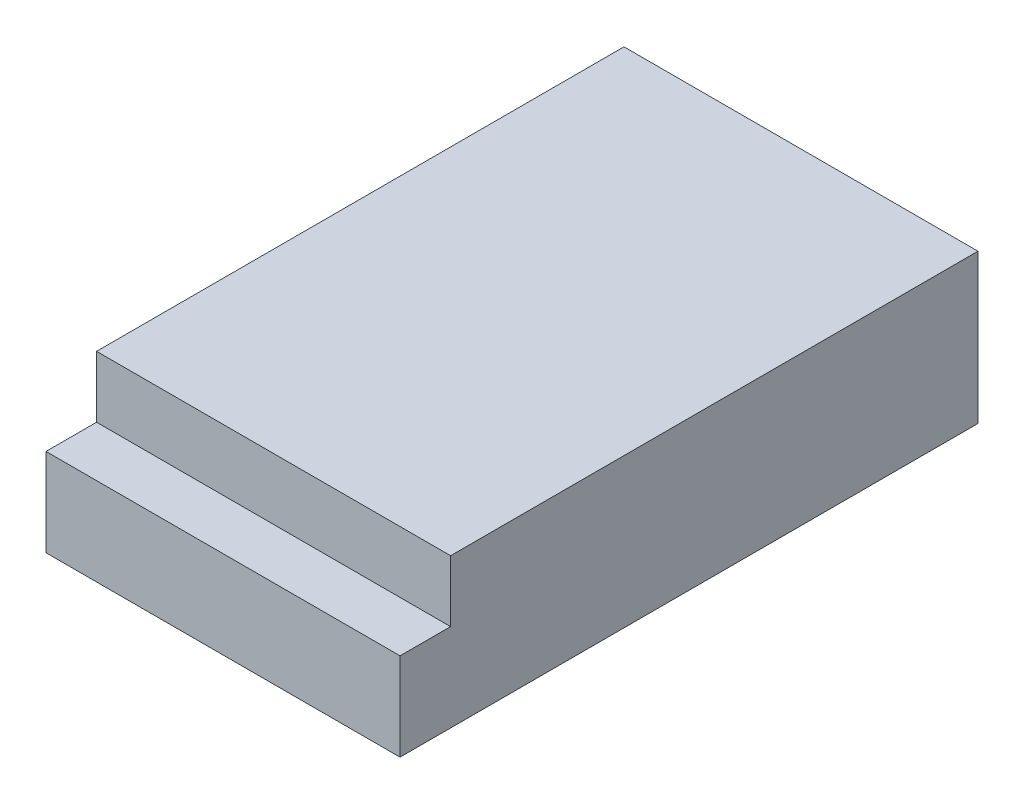
ISO-10303-21;
HEADER;
FILE_DESCRIPTION(('STEP AP214'),'2;1');
FILE_NAME('part.step','',(''),(''),'','','');
FILE_SCHEMA(('AUTOMOTIVE_DESIGN { 1 0 10303 214 1 1 1 1 }'));
ENDSEC;
DATA;
#1=APPLICATION_CONTEXT('core data for automotive mechanical design processes');
#2=APPLICATION_PROTOCOL_DEFINITION('international standard','automotive_design',2000,#1);
#3=PRODUCT_CONTEXT('',#1,'mechanical');
#4=PRODUCT('Part','Part','',(#3));
#5=PRODUCT_RELATED_PRODUCT_CATEGORY('part','',(#4));
#6=PRODUCT_DEFINITION_FORMATION('','',#4);
#7=PRODUCT_DEFINITION_CONTEXT('part definition',#1,'design');
#8=PRODUCT_DEFINITION('design','',#6,#7);
#9=PRODUCT_DEFINITION_SHAPE('','',#8);
#10=(LENGTH_UNIT() NAMED_UNIT(*) SI_UNIT(.MILLI.,.METRE.));
#11=(NAMED_UNIT(*) PLANE_ANGLE_UNIT() SI_UNIT($,.RADIAN.));
#12=(NAMED_UNIT(*) SI_UNIT($,.STERADIAN.) SOLID_ANGLE_UNIT());
#13=UNCERTAINTY_MEASURE_WITH_UNIT(LENGTH_MEASURE(1.E-05),#10,'distance_accuracy_value','');
#14=(GEOMETRIC_REPRESENTATION_CONTEXT(3) GLOBAL_UNCERTAINTY_ASSIGNED_CONTEXT((#13)) GLOBAL_UNIT_ASSIGNED_CONTEXT((#10,
#11,#12)) REPRESENTATION_CONTEXT('',''));
#15=CARTESIAN_POINT('',(0.,0.,0.));
#16=DIRECTION('',(0.,0.,1.));
#17=DIRECTION('',(1.,0.,0.));
#18=AXIS2_PLACEMENT_3D('',#15,#16,#17);
#19=CARTESIAN_POINT('',(49.,41.3,80.));
#20=DIRECTION('',(-1.,0.,0.));
#21=DIRECTION('',(0.,0.,1.));
#22=AXIS2_PLACEMENT_3D('',#19,#20,#21);
#23=PLANE('',#22);
#24=DIRECTION('',(0.,0.,-1.));
#25=VECTOR('',#24,1.);
#26=CARTESIAN_POINT('',(49.,41.3,80.));
#27=LINE('',#26,#25);
#28=CARTESIAN_POINT('',(49.,41.3,66.));
#29=VERTEX_POINT('',#28);
#30=CARTESIAN_POINT('',(49.,41.3,-80.));
#31=VERTEX_POINT('',#30);
#32=EDGE_CURVE('E97',#29,#31,#27,.T.);
#33=ORIENTED_EDGE('',*,*,#32,.F.);
#34=DIRECTION('',(0.,1.,0.));
#35=VECTOR('',#34,1.);
#36=CARTESIAN_POINT('',(49.,41.3,66.));
#37=LINE('',#36,#35);
#38=CARTESIAN_POINT('',(49.,24.3,66.));
#39=VERTEX_POINT('',#38);
#40=EDGE_CURVE('E47',#39,#29,#37,.T.);
#41=ORIENTED_EDGE('',*,*,#40,.F.);
#42=DIRECTION('',(0.,0.,-1.));
#43=VECTOR('',#42,1.);
#44=CARTESIAN_POINT('',(49.,24.3,80.));
#45=LINE('',#44,#43);
#46=CARTESIAN_POINT('',(49.,24.3,80.));
#47=VERTEX_POINT('',#46);
#48=EDGE_CURVE('E84',#47,#39,#45,.T.);
#49=ORIENTED_EDGE('',*,*,#48,.F.);
#50=DIRECTION('',(0.,-1.,0.));
#51=VECTOR('',#50,1.);
#52=CARTESIAN_POINT('',(49.,41.3,80.));
#53=LINE('',#52,#51);
#54=CARTESIAN_POINT('',(49.,0.,80.));
#55=VERTEX_POINT('',#54);
#56=EDGE_CURVE('E76',#47,#55,#53,.T.);
#57=ORIENTED_EDGE('',*,*,#56,.T.);
#58=DIRECTION('',(0.,0.,-1.));
#59=VECTOR('',#58,1.);
#60=CARTESIAN_POINT('',(49.,0.,80.));
#61=LINE('',#60,#59);
#62=CARTESIAN_POINT('',(49.,0.,-80.));
#63=VERTEX_POINT('',#62);
#64=EDGE_CURVE('E81',#55,#63,#61,.T.);
#65=ORIENTED_EDGE('',*,*,#64,.T.);
#66=DIRECTION('',(0.,-1.,0.));
#67=VECTOR('',#66,1.);
#68=CARTESIAN_POINT('',(49.,41.3,-80.));
#69=LINE('',#68,#67);
#70=EDGE_CURVE('E11',#31,#63,#69,.T.);
#71=ORIENTED_EDGE('',*,*,#70,.F.);
#72=EDGE_LOOP('',(#33,#41,#49,#57,#65,#71));
#73=FACE_BOUND('',#72,.T.);
#74=ADVANCED_FACE('F33',(#73),#23,.F.);
#75=CARTESIAN_POINT('',(-49.,41.3,-80.));
#76=DIRECTION('',(0.,0.,1.));
#77=DIRECTION('',(1.,0.,0.));
#78=AXIS2_PLACEMENT_3D('',#75,#76,#77);
#79=PLANE('',#78);
#80=DIRECTION('',(-1.,0.,0.));
#81=VECTOR('',#80,1.);
#82=CARTESIAN_POINT('',(-49.,0.,-80.));
#83=LINE('',#82,#81);
#84=CARTESIAN_POINT('',(-49.,0.,-80.));
#85=VERTEX_POINT('',#84);
#86=EDGE_CURVE('E101',#63,#85,#83,.T.);
#87=ORIENTED_EDGE('',*,*,#86,.T.);
#88=DIRECTION('',(0.,-1.,0.));
#89=VECTOR('',#88,1.);
#90=CARTESIAN_POINT('',(-49.,41.3,-80.));
#91=LINE('',#90,#89);
#92=CARTESIAN_POINT('',(-49.,41.3,-80.));
#93=VERTEX_POINT('',#92);
#94=EDGE_CURVE('E40',#93,#85,#91,.T.);
#95=ORIENTED_EDGE('',*,*,#94,.F.);
#96=DIRECTION('',(-1.,0.,0.));
#97=VECTOR('',#96,1.);
#98=CARTESIAN_POINT('',(-49.,41.3,-80.));
#99=LINE('',#98,#97);
#100=EDGE_CURVE('E56',#31,#93,#99,.T.);
#101=ORIENTED_EDGE('',*,*,#100,.F.);
#102=ORIENTED_EDGE('',*,*,#70,.T.);
#103=EDGE_LOOP('',(#87,#95,#101,#102));
#104=FACE_BOUND('',#103,.T.);
#105=ADVANCED_FACE('F118',(#104),#79,.F.);
#106=CARTESIAN_POINT('',(-49.,41.3,80.));
#107=DIRECTION('',(1.,0.,0.));
#108=DIRECTION('',(0.,0.,-1.));
#109=AXIS2_PLACEMENT_3D('',#106,#107,#108);
#110=PLANE('',#109);
#111=DIRECTION('',(0.,0.,-1.));
#112=VECTOR('',#111,1.);
#113=CARTESIAN_POINT('',(-49.,24.3,80.));
#114=LINE('',#113,#112);
#115=CARTESIAN_POINT('',(-49.,24.3,80.));
#116=VERTEX_POINT('',#115);
#117=CARTESIAN_POINT('',(-49.,24.3,66.));
#118=VERTEX_POINT('',#117);
#119=EDGE_CURVE('E128',#116,#118,#114,.T.);
#120=ORIENTED_EDGE('',*,*,#119,.T.);
#121=DIRECTION('',(0.,1.,0.));
#122=VECTOR('',#121,1.);
#123=CARTESIAN_POINT('',(-49.,41.3,66.));
#124=LINE('',#123,#122);
#125=CARTESIAN_POINT('',(-49.,41.3,66.));
#126=VERTEX_POINT('',#125);
#127=EDGE_CURVE('E125',#118,#126,#124,.T.);
#128=ORIENTED_EDGE('',*,*,#127,.T.);
#129=DIRECTION('',(0.,0.,1.));
#130=VECTOR('',#129,1.);
#131=CARTESIAN_POINT('',(-49.,41.3,80.));
#132=LINE('',#131,#130);
#133=EDGE_CURVE('E88',#93,#126,#132,.T.);
#134=ORIENTED_EDGE('',*,*,#133,.F.);
#135=ORIENTED_EDGE('',*,*,#94,.T.);
#136=DIRECTION('',(0.,0.,1.));
#137=VECTOR('',#136,1.);
#138=CARTESIAN_POINT('',(-49.,0.,80.));
#139=LINE('',#138,#137);
#140=CARTESIAN_POINT('',(-49.,0.,80.));
#141=VERTEX_POINT('',#140);
#142=EDGE_CURVE('E98',#85,#141,#139,.T.);
#143=ORIENTED_EDGE('',*,*,#142,.T.);
#144=DIRECTION('',(0.,-1.,0.));
#145=VECTOR('',#144,1.);
#146=CARTESIAN_POINT('',(-49.,41.3,80.));
#147=LINE('',#146,#145);
#148=EDGE_CURVE('E87',#116,#141,#147,.T.);
#149=ORIENTED_EDGE('',*,*,#148,.F.);
#150=EDGE_LOOP('',(#120,#128,#134,#135,#143,#149));
#151=FACE_BOUND('',#150,.T.);
#152=ADVANCED_FACE('F115',(#151),#110,.F.);
#153=CARTESIAN_POINT('',(-49.,41.3,80.));
#154=DIRECTION('',(0.,0.,-1.));
#155=DIRECTION('',(-1.,0.,0.));
#156=AXIS2_PLACEMENT_3D('',#153,#154,#155);
#157=PLANE('',#156);
#158=ORIENTED_EDGE('',*,*,#56,.F.);
#159=DIRECTION('',(1.,0.,0.));
#160=VECTOR('',#159,1.);
#161=CARTESIAN_POINT('',(-49.,24.3,80.));
#162=LINE('',#161,#160);
#163=EDGE_CURVE('E122',#116,#47,#162,.T.);
#164=ORIENTED_EDGE('',*,*,#163,.F.);
#165=ORIENTED_EDGE('',*,*,#148,.T.);
#166=DIRECTION('',(1.,0.,0.));
#167=VECTOR('',#166,1.);
#168=CARTESIAN_POINT('',(-49.,0.,80.));
#169=LINE('',#168,#167);
#170=EDGE_CURVE('E91',#141,#55,#169,.T.);
#171=ORIENTED_EDGE('',*,*,#170,.T.);
#172=EDGE_LOOP('',(#158,#164,#165,#171));
#173=FACE_BOUND('',#172,.T.);
#174=ADVANCED_FACE('F92',(#173),#157,.F.);
#175=CARTESIAN_POINT('',(0.,41.3,0.));
#176=DIRECTION('',(0.,-1.,0.));
#177=DIRECTION('',(0.,0.,-1.));
#178=AXIS2_PLACEMENT_3D('',#175,#176,#177);
#179=PLANE('',#178);
#180=ORIENTED_EDGE('',*,*,#133,.T.);
#181=DIRECTION('',(1.,0.,0.));
#182=VECTOR('',#181,1.);
#183=CARTESIAN_POINT('',(-49.,41.3,66.));
#184=LINE('',#183,#182);
#185=EDGE_CURVE('E102',#126,#29,#184,.T.);
#186=ORIENTED_EDGE('',*,*,#185,.T.);
#187=ORIENTED_EDGE('',*,*,#32,.T.);
#188=ORIENTED_EDGE('',*,*,#100,.T.);
#189=EDGE_LOOP('',(#180,#186,#187,#188));
#190=FACE_BOUND('',#189,.T.);
#191=ADVANCED_FACE('F143',(#190),#179,.F.);
#192=CARTESIAN_POINT('',(0.,0.,0.));
#193=DIRECTION('',(0.,-1.,0.));
#194=DIRECTION('',(0.,0.,-1.));
#195=AXIS2_PLACEMENT_3D('',#192,#193,#194);
#196=PLANE('',#195);
#197=ORIENTED_EDGE('',*,*,#64,.F.);
#198=ORIENTED_EDGE('',*,*,#170,.F.);
#199=ORIENTED_EDGE('',*,*,#142,.F.);
#200=ORIENTED_EDGE('',*,*,#86,.F.);
#201=EDGE_LOOP('',(#197,#198,#199,#200));
#202=FACE_BOUND('',#201,.T.);
#203=ADVANCED_FACE('F100',(#202),#196,.T.);
#204=CARTESIAN_POINT('',(-49.,41.3,66.));
#205=DIRECTION('',(0.,0.,-1.));
#206=DIRECTION('',(-1.,0.,0.));
#207=AXIS2_PLACEMENT_3D('',#204,#205,#206);
#208=PLANE('',#207);
#209=ORIENTED_EDGE('',*,*,#40,.T.);
#210=ORIENTED_EDGE('',*,*,#185,.F.);
#211=ORIENTED_EDGE('',*,*,#127,.F.);
#212=DIRECTION('',(1.,0.,0.));
#213=VECTOR('',#212,1.);
#214=CARTESIAN_POINT('',(-49.,24.3,66.));
#215=LINE('',#214,#213);
#216=EDGE_CURVE('E105',#118,#39,#215,.T.);
#217=ORIENTED_EDGE('',*,*,#216,.T.);
#218=EDGE_LOOP('',(#209,#210,#211,#217));
#219=FACE_BOUND('',#218,.T.);
#220=ADVANCED_FACE('F142',(#219),#208,.F.);
#221=CARTESIAN_POINT('',(-49.,24.3,80.));
#222=DIRECTION('',(0.,-1.,0.));
#223=DIRECTION('',(0.,0.,-1.));
#224=AXIS2_PLACEMENT_3D('',#221,#222,#223);
#225=PLANE('',#224);
#226=ORIENTED_EDGE('',*,*,#48,.T.);
#227=ORIENTED_EDGE('',*,*,#216,.F.);
#228=ORIENTED_EDGE('',*,*,#119,.F.);
#229=ORIENTED_EDGE('',*,*,#163,.T.);
#230=EDGE_LOOP('',(#226,#227,#228,#229));
#231=FACE_BOUND('',#230,.T.);
#232=ADVANCED_FACE('F138',(#231),#225,.F.);
#233=CLOSED_SHELL('',(#74,#105,#152,#174,#191,#203,#220,#232));
#234=MANIFOLD_SOLID_BREP('B2',#233);
#235=ADVANCED_BREP_SHAPE_REPRESENTATION('',(#18,#234),#14);
#236=SHAPE_DEFINITION_REPRESENTATION(#9,#235);
ENDSEC;
END-ISO-10303-21;
